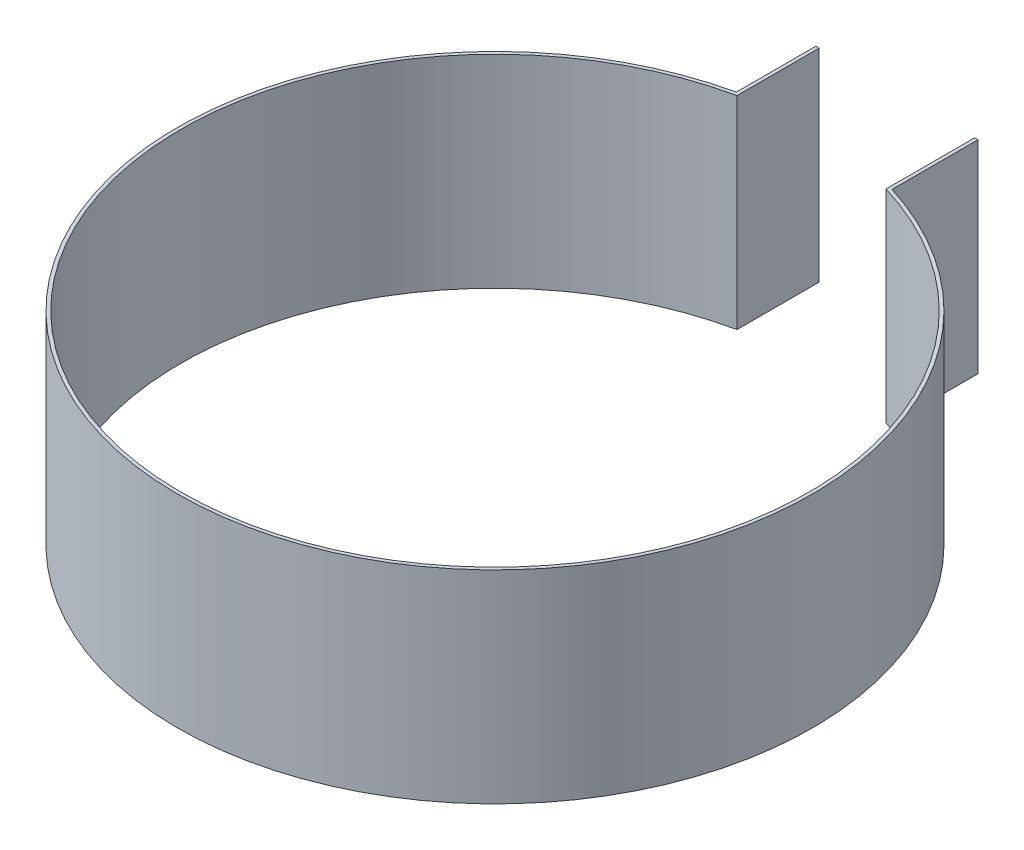
ISO-10303-21;
HEADER;
FILE_DESCRIPTION(('STEP AP214'),'2;1');
FILE_NAME('part.step','',(''),(''),'','','');
FILE_SCHEMA(('AUTOMOTIVE_DESIGN { 1 0 10303 214 1 1 1 1 }'));
ENDSEC;
DATA;
#1=APPLICATION_CONTEXT('core data for automotive mechanical design processes');
#2=APPLICATION_PROTOCOL_DEFINITION('international standard','automotive_design',2000,#1);
#3=PRODUCT_CONTEXT('',#1,'mechanical');
#4=PRODUCT('Part','Part','',(#3));
#5=PRODUCT_RELATED_PRODUCT_CATEGORY('part','',(#4));
#6=PRODUCT_DEFINITION_FORMATION('','',#4);
#7=PRODUCT_DEFINITION_CONTEXT('part definition',#1,'design');
#8=PRODUCT_DEFINITION('design','',#6,#7);
#9=PRODUCT_DEFINITION_SHAPE('','',#8);
#10=(LENGTH_UNIT() NAMED_UNIT(*) SI_UNIT(.MILLI.,.METRE.));
#11=(NAMED_UNIT(*) PLANE_ANGLE_UNIT() SI_UNIT($,.RADIAN.));
#12=(NAMED_UNIT(*) SI_UNIT($,.STERADIAN.) SOLID_ANGLE_UNIT());
#13=UNCERTAINTY_MEASURE_WITH_UNIT(LENGTH_MEASURE(1.E-05),#10,'distance_accuracy_value','');
#14=(GEOMETRIC_REPRESENTATION_CONTEXT(3) GLOBAL_UNCERTAINTY_ASSIGNED_CONTEXT((#13)) GLOBAL_UNIT_ASSIGNED_CONTEXT((#10,
#11,#12)) REPRESENTATION_CONTEXT('',''));
#15=CARTESIAN_POINT('',(0.,0.,0.));
#16=DIRECTION('',(0.,0.,1.));
#17=DIRECTION('',(1.,0.,0.));
#18=AXIS2_PLACEMENT_3D('',#15,#16,#17);
#19=CARTESIAN_POINT('',(13.8378489251027,60.,-57.6622106949317));
#20=DIRECTION('',(0.,0.,1.));
#21=DIRECTION('',(1.,0.,0.));
#22=AXIS2_PLACEMENT_3D('',#19,#20,#21);
#23=PLANE('',#22);
#24=DIRECTION('',(0.,-1.,0.));
#25=VECTOR('',#24,1.);
#26=CARTESIAN_POINT('',(13.3378489251027,209.801011309857,-57.6622106949317));
#27=LINE('',#26,#25);
#28=CARTESIAN_POINT('',(13.3378489251027,30.,-57.6622106949317));
#29=VERTEX_POINT('',#28);
#30=CARTESIAN_POINT('',(13.3378489251027,0.,-57.6622106949317));
#31=VERTEX_POINT('',#30);
#32=EDGE_CURVE('E119',#29,#31,#27,.T.);
#33=ORIENTED_EDGE('',*,*,#32,.F.);
#34=DIRECTION('',(-1.,0.,0.));
#35=VECTOR('',#34,1.);
#36=CARTESIAN_POINT('',(13.8378489251027,30.,-57.6622106949317));
#37=LINE('',#36,#35);
#38=CARTESIAN_POINT('',(13.8378489251027,30.,-57.6622106949317));
#39=VERTEX_POINT('',#38);
#40=EDGE_CURVE('E127',#39,#29,#37,.T.);
#41=ORIENTED_EDGE('',*,*,#40,.F.);
#42=DIRECTION('',(0.,-1.,0.));
#43=VECTOR('',#42,1.);
#44=CARTESIAN_POINT('',(13.8378489251027,60.,-57.6622106949317));
#45=LINE('',#44,#43);
#46=CARTESIAN_POINT('',(13.8378489251027,0.,-57.6622106949317));
#47=VERTEX_POINT('',#46);
#48=EDGE_CURVE('E145',#39,#47,#45,.T.);
#49=ORIENTED_EDGE('',*,*,#48,.T.);
#50=DIRECTION('',(-1.,0.,0.));
#51=VECTOR('',#50,1.);
#52=CARTESIAN_POINT('',(13.8378489251027,0.,-57.6622106949317));
#53=LINE('',#52,#51);
#54=EDGE_CURVE('E139',#47,#31,#53,.T.);
#55=ORIENTED_EDGE('',*,*,#54,.T.);
#56=EDGE_LOOP('',(#33,#41,#49,#55));
#57=FACE_BOUND('',#56,.T.);
#58=ADVANCED_FACE('F36',(#57),#23,.F.);
#59=CARTESIAN_POINT('',(-10.1621510748973,60.,-57.6622106949317));
#60=DIRECTION('',(1.,0.,0.));
#61=DIRECTION('',(0.,0.,-1.));
#62=AXIS2_PLACEMENT_3D('',#59,#60,#61);
#63=PLANE('',#62);
#64=DIRECTION('',(0.,0.,1.));
#65=VECTOR('',#64,1.);
#66=CARTESIAN_POINT('',(-10.1621510748973,30.,-57.6622106949317));
#67=LINE('',#66,#65);
#68=CARTESIAN_POINT('',(-10.1621510748973,30.,-57.6622106949317));
#69=VERTEX_POINT('',#68);
#70=CARTESIAN_POINT('',(-10.1621510748973,30.,-45.8882412555871));
#71=VERTEX_POINT('',#70);
#72=EDGE_CURVE('E130',#69,#71,#67,.T.);
#73=ORIENTED_EDGE('',*,*,#72,.F.);
#74=DIRECTION('',(0.,-1.,0.));
#75=VECTOR('',#74,1.);
#76=CARTESIAN_POINT('',(-10.1621510748973,60.,-57.6622106949317));
#77=LINE('',#76,#75);
#78=CARTESIAN_POINT('',(-10.1621510748973,0.,-57.6622106949317));
#79=VERTEX_POINT('',#78);
#80=EDGE_CURVE('E142',#69,#79,#77,.T.);
#81=ORIENTED_EDGE('',*,*,#80,.T.);
#82=DIRECTION('',(0.,0.,1.));
#83=VECTOR('',#82,1.);
#84=CARTESIAN_POINT('',(-10.1621510748973,0.,-57.6622106949317));
#85=LINE('',#84,#83);
#86=CARTESIAN_POINT('',(-10.1621510748973,0.,-45.8882412555871));
#87=VERTEX_POINT('',#86);
#88=EDGE_CURVE('E134',#79,#87,#85,.T.);
#89=ORIENTED_EDGE('',*,*,#88,.T.);
#90=DIRECTION('',(0.,-1.,0.));
#91=VECTOR('',#90,1.);
#92=CARTESIAN_POINT('',(-10.1621510748973,30.,-45.8882412555871));
#93=LINE('',#92,#91);
#94=EDGE_CURVE('E149',#87,#71,#93,.F.);
#95=ORIENTED_EDGE('',*,*,#94,.T.);
#96=EDGE_LOOP('',(#73,#81,#89,#95));
#97=FACE_BOUND('',#96,.T.);
#98=ADVANCED_FACE('F180',(#97),#63,.F.);
#99=CARTESIAN_POINT('',(13.8378489251027,60.,-42.6622106949317));
#100=DIRECTION('',(-1.,0.,0.));
#101=DIRECTION('',(0.,0.,1.));
#102=AXIS2_PLACEMENT_3D('',#99,#100,#101);
#103=PLANE('',#102);
#104=DIRECTION('',(0.,0.,-1.));
#105=VECTOR('',#104,1.);
#106=CARTESIAN_POINT('',(13.8378489251027,30.,-42.6622106949317));
#107=LINE('',#106,#105);
#108=CARTESIAN_POINT('',(13.8378489251027,30.,-44.9167445072106));
#109=VERTEX_POINT('',#108);
#110=EDGE_CURVE('E132',#109,#39,#107,.T.);
#111=ORIENTED_EDGE('',*,*,#110,.F.);
#112=DIRECTION('',(0.,-1.,0.));
#113=VECTOR('',#112,1.);
#114=CARTESIAN_POINT('',(13.8378489251027,30.,-44.9167445072106));
#115=LINE('',#114,#113);
#116=CARTESIAN_POINT('',(13.8378489251027,0.,-44.9167445072106));
#117=VERTEX_POINT('',#116);
#118=EDGE_CURVE('E147',#109,#117,#115,.T.);
#119=ORIENTED_EDGE('',*,*,#118,.T.);
#120=DIRECTION('',(0.,0.,-1.));
#121=VECTOR('',#120,1.);
#122=CARTESIAN_POINT('',(13.8378489251027,0.,-42.6622106949317));
#123=LINE('',#122,#121);
#124=EDGE_CURVE('E136',#117,#47,#123,.T.);
#125=ORIENTED_EDGE('',*,*,#124,.T.);
#126=ORIENTED_EDGE('',*,*,#48,.F.);
#127=EDGE_LOOP('',(#111,#119,#125,#126));
#128=FACE_BOUND('',#127,.T.);
#129=ADVANCED_FACE('F166',(#128),#103,.F.);
#130=CARTESIAN_POINT('',(-9.66215107489733,30.,-57.6622106949317));
#131=VERTEX_POINT('',#130);
#132=EDGE_CURVE('E120',#131,#69,#37,.T.);
#133=ORIENTED_EDGE('',*,*,#132,.F.);
#134=DIRECTION('',(0.,-1.,0.));
#135=VECTOR('',#134,1.);
#136=CARTESIAN_POINT('',(-9.66215107489733,209.801011309857,-57.6622106949317));
#137=LINE('',#136,#135);
#138=CARTESIAN_POINT('',(-9.66215107489733,0.,-57.6622106949317));
#139=VERTEX_POINT('',#138);
#140=EDGE_CURVE('E123',#131,#139,#137,.T.);
#141=ORIENTED_EDGE('',*,*,#140,.T.);
#142=EDGE_CURVE('E103',#139,#79,#53,.T.);
#143=ORIENTED_EDGE('',*,*,#142,.T.);
#144=ORIENTED_EDGE('',*,*,#80,.F.);
#145=EDGE_LOOP('',(#133,#141,#143,#144));
#146=FACE_BOUND('',#145,.T.);
#147=ADVANCED_FACE('F178',(#146),#23,.F.);
#148=CARTESIAN_POINT('',(0.,30.,0.));
#149=DIRECTION('',(0.,-1.,0.));
#150=DIRECTION('',(0.,0.,-1.));
#151=AXIS2_PLACEMENT_3D('',#148,#149,#150);
#152=CYLINDRICAL_SURFACE('',#151,47.);
#153=ORIENTED_EDGE('',*,*,#94,.F.);
#154=CARTESIAN_POINT('',(0.,0.,0.));
#155=DIRECTION('',(0.,1.,0.));
#156=DIRECTION('',(0.,0.,1.));
#157=AXIS2_PLACEMENT_3D('',#154,#155,#156);
#158=CIRCLE('',#157,47.);
#159=EDGE_CURVE('E152',#87,#117,#158,.T.);
#160=ORIENTED_EDGE('',*,*,#159,.T.);
#161=ORIENTED_EDGE('',*,*,#118,.F.);
#162=CARTESIAN_POINT('',(0.,30.,0.));
#163=DIRECTION('',(0.,1.,0.));
#164=DIRECTION('',(0.,0.,1.));
#165=AXIS2_PLACEMENT_3D('',#162,#163,#164);
#166=CIRCLE('',#165,47.);
#167=EDGE_CURVE('E153',#71,#109,#166,.T.);
#168=ORIENTED_EDGE('',*,*,#167,.F.);
#169=EDGE_LOOP('',(#153,#160,#161,#168));
#170=FACE_BOUND('',#169,.T.);
#171=ADVANCED_FACE('F38',(#170),#152,.T.);
#172=CARTESIAN_POINT('',(0.,30.,0.));
#173=DIRECTION('',(0.,1.,0.));
#174=DIRECTION('',(0.,0.,1.));
#175=AXIS2_PLACEMENT_3D('',#172,#173,#174);
#176=PLANE('',#175);
#177=CARTESIAN_POINT('',(0.,30.,0.));
#178=DIRECTION('',(0.,1.,0.));
#179=DIRECTION('',(0.,0.,1.));
#180=AXIS2_PLACEMENT_3D('',#177,#178,#179);
#181=CIRCLE('',#180,46.5);
#182=CARTESIAN_POINT('',(-9.66215107489732,30.,-45.4850836715275));
#183=VERTEX_POINT('',#182);
#184=CARTESIAN_POINT('',(13.3378489251027,30.,-44.5460636426064));
#185=VERTEX_POINT('',#184);
#186=EDGE_CURVE('E112',#183,#185,#181,.T.);
#187=ORIENTED_EDGE('',*,*,#186,.F.);
#188=DIRECTION('',(0.,0.,1.));
#189=VECTOR('',#188,1.);
#190=CARTESIAN_POINT('',(-9.66215107489733,30.,-57.6622106949317));
#191=LINE('',#190,#189);
#192=EDGE_CURVE('E51',#131,#183,#191,.T.);
#193=ORIENTED_EDGE('',*,*,#192,.F.);
#194=ORIENTED_EDGE('',*,*,#132,.T.);
#195=ORIENTED_EDGE('',*,*,#72,.T.);
#196=ORIENTED_EDGE('',*,*,#167,.T.);
#197=ORIENTED_EDGE('',*,*,#110,.T.);
#198=ORIENTED_EDGE('',*,*,#40,.T.);
#199=DIRECTION('',(0.,0.,-1.));
#200=VECTOR('',#199,1.);
#201=CARTESIAN_POINT('',(13.3378489251027,30.,-45.6622106949317));
#202=LINE('',#201,#200);
#203=EDGE_CURVE('E116',#185,#29,#202,.T.);
#204=ORIENTED_EDGE('',*,*,#203,.F.);
#205=EDGE_LOOP('',(#187,#193,#194,#195,#196,#197,#198,#204));
#206=FACE_BOUND('',#205,.T.);
#207=ADVANCED_FACE('F169',(#206),#176,.T.);
#208=CARTESIAN_POINT('',(0.,0.,0.));
#209=DIRECTION('',(0.,1.,0.));
#210=DIRECTION('',(0.,0.,1.));
#211=AXIS2_PLACEMENT_3D('',#208,#209,#210);
#212=PLANE('',#211);
#213=DIRECTION('',(0.,0.,1.));
#214=VECTOR('',#213,1.);
#215=CARTESIAN_POINT('',(-9.66215107489733,0.,-57.6622106949317));
#216=LINE('',#215,#214);
#217=CARTESIAN_POINT('',(-9.66215107489732,0.,-45.4850836715275));
#218=VERTEX_POINT('',#217);
#219=EDGE_CURVE('E100',#139,#218,#216,.T.);
#220=ORIENTED_EDGE('',*,*,#219,.T.);
#221=CARTESIAN_POINT('',(0.,0.,0.));
#222=DIRECTION('',(0.,1.,0.));
#223=DIRECTION('',(0.,0.,1.));
#224=AXIS2_PLACEMENT_3D('',#221,#222,#223);
#225=CIRCLE('',#224,46.5);
#226=CARTESIAN_POINT('',(13.3378489251027,0.,-44.5460636426064));
#227=VERTEX_POINT('',#226);
#228=EDGE_CURVE('E58',#218,#227,#225,.T.);
#229=ORIENTED_EDGE('',*,*,#228,.T.);
#230=DIRECTION('',(0.,0.,-1.));
#231=VECTOR('',#230,1.);
#232=CARTESIAN_POINT('',(13.3378489251027,0.,-45.6622106949317));
#233=LINE('',#232,#231);
#234=EDGE_CURVE('E104',#227,#31,#233,.T.);
#235=ORIENTED_EDGE('',*,*,#234,.T.);
#236=ORIENTED_EDGE('',*,*,#54,.F.);
#237=ORIENTED_EDGE('',*,*,#124,.F.);
#238=ORIENTED_EDGE('',*,*,#159,.F.);
#239=ORIENTED_EDGE('',*,*,#88,.F.);
#240=ORIENTED_EDGE('',*,*,#142,.F.);
#241=EDGE_LOOP('',(#220,#229,#235,#236,#237,#238,#239,#240));
#242=FACE_BOUND('',#241,.T.);
#243=ADVANCED_FACE('F101',(#242),#212,.F.);
#244=CARTESIAN_POINT('',(13.3378489251027,209.801011309857,-45.6622106949317));
#245=DIRECTION('',(-1.,0.,0.));
#246=DIRECTION('',(0.,0.,1.));
#247=AXIS2_PLACEMENT_3D('',#244,#245,#246);
#248=PLANE('',#247);
#249=ORIENTED_EDGE('',*,*,#234,.F.);
#250=DIRECTION('',(0.,1.,0.));
#251=VECTOR('',#250,1.);
#252=CARTESIAN_POINT('',(13.3378489251027,0.,-44.5460636426064));
#253=LINE('',#252,#251);
#254=EDGE_CURVE('E44',#185,#227,#253,.F.);
#255=ORIENTED_EDGE('',*,*,#254,.F.);
#256=ORIENTED_EDGE('',*,*,#203,.T.);
#257=ORIENTED_EDGE('',*,*,#32,.T.);
#258=EDGE_LOOP('',(#249,#255,#256,#257));
#259=FACE_BOUND('',#258,.T.);
#260=ADVANCED_FACE('F173',(#259),#248,.T.);
#261=CARTESIAN_POINT('',(-9.66215107489733,209.801011309857,-57.6622106949317));
#262=DIRECTION('',(1.,0.,0.));
#263=DIRECTION('',(0.,0.,-1.));
#264=AXIS2_PLACEMENT_3D('',#261,#262,#263);
#265=PLANE('',#264);
#266=ORIENTED_EDGE('',*,*,#140,.F.);
#267=ORIENTED_EDGE('',*,*,#192,.T.);
#268=DIRECTION('',(0.,1.,0.));
#269=VECTOR('',#268,1.);
#270=CARTESIAN_POINT('',(-9.66215107489732,0.,-45.4850836715275));
#271=LINE('',#270,#269);
#272=EDGE_CURVE('E11',#218,#183,#271,.T.);
#273=ORIENTED_EDGE('',*,*,#272,.F.);
#274=ORIENTED_EDGE('',*,*,#219,.F.);
#275=EDGE_LOOP('',(#266,#267,#273,#274));
#276=FACE_BOUND('',#275,.T.);
#277=ADVANCED_FACE('F106',(#276),#265,.T.);
#278=CARTESIAN_POINT('',(0.,0.,0.));
#279=DIRECTION('',(0.,1.,0.));
#280=DIRECTION('',(0.,0.,1.));
#281=AXIS2_PLACEMENT_3D('',#278,#279,#280);
#282=CYLINDRICAL_SURFACE('',#281,46.5);
#283=ORIENTED_EDGE('',*,*,#228,.F.);
#284=ORIENTED_EDGE('',*,*,#272,.T.);
#285=ORIENTED_EDGE('',*,*,#186,.T.);
#286=ORIENTED_EDGE('',*,*,#254,.T.);
#287=EDGE_LOOP('',(#283,#284,#285,#286));
#288=FACE_BOUND('',#287,.T.);
#289=ADVANCED_FACE('F110',(#288),#282,.F.);
#290=CLOSED_SHELL('',(#58,#98,#129,#147,#171,#207,#243,#260,#277,#289));
#291=MANIFOLD_SOLID_BREP('B2',#290);
#292=ADVANCED_BREP_SHAPE_REPRESENTATION('',(#18,#291),#14);
#293=SHAPE_DEFINITION_REPRESENTATION(#9,#292);
ENDSEC;
END-ISO-10303-21;
